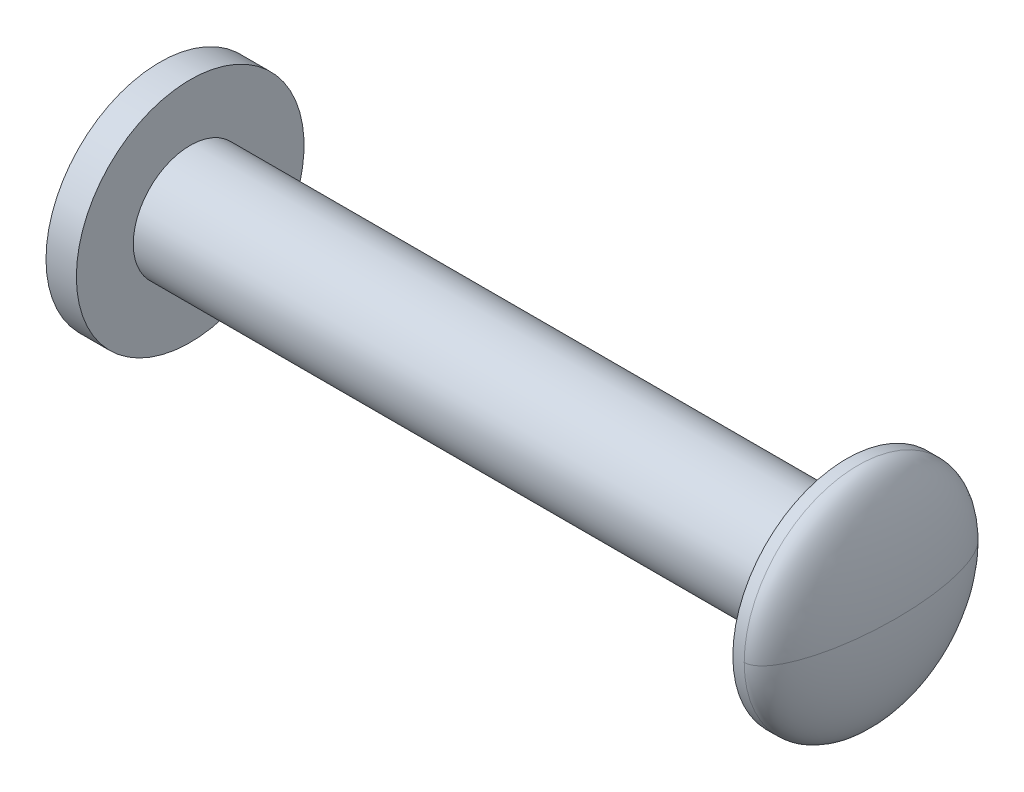
ISO-10303-21;
HEADER;
FILE_DESCRIPTION(('STEP AP214'),'2;1');
FILE_NAME('part.step','',(''),(''),'','','');
FILE_SCHEMA(('AUTOMOTIVE_DESIGN { 1 0 10303 214 1 1 1 1 }'));
ENDSEC;
DATA;
#1=APPLICATION_CONTEXT('core data for automotive mechanical design processes');
#2=APPLICATION_PROTOCOL_DEFINITION('international standard','automotive_design',2000,#1);
#3=PRODUCT_CONTEXT('',#1,'mechanical');
#4=PRODUCT('Part','Part','',(#3));
#5=PRODUCT_RELATED_PRODUCT_CATEGORY('part','',(#4));
#6=PRODUCT_DEFINITION_FORMATION('','',#4);
#7=PRODUCT_DEFINITION_CONTEXT('part definition',#1,'design');
#8=PRODUCT_DEFINITION('design','',#6,#7);
#9=PRODUCT_DEFINITION_SHAPE('','',#8);
#10=(LENGTH_UNIT() NAMED_UNIT(*) SI_UNIT(.MILLI.,.METRE.));
#11=(NAMED_UNIT(*) PLANE_ANGLE_UNIT() SI_UNIT($,.RADIAN.));
#12=(NAMED_UNIT(*) SI_UNIT($,.STERADIAN.) SOLID_ANGLE_UNIT());
#13=UNCERTAINTY_MEASURE_WITH_UNIT(LENGTH_MEASURE(1.E-05),#10,'distance_accuracy_value','');
#14=(GEOMETRIC_REPRESENTATION_CONTEXT(3) GLOBAL_UNCERTAINTY_ASSIGNED_CONTEXT((#13)) GLOBAL_UNIT_ASSIGNED_CONTEXT((#10,
#11,#12)) REPRESENTATION_CONTEXT('',''));
#15=CARTESIAN_POINT('',(0.,0.,0.));
#16=DIRECTION('',(0.,0.,1.));
#17=DIRECTION('',(1.,0.,0.));
#18=AXIS2_PLACEMENT_3D('',#15,#16,#17);
#19=CARTESIAN_POINT('',(19.4,0.,0.));
#20=CARTESIAN_POINT('',(19.4,0.,0.));
#21=CARTESIAN_POINT('',(19.4,0.,0.));
#22=CARTESIAN_POINT('',(19.4,0.,0.));
#23=CARTESIAN_POINT('',(19.4,0.,-1.75735931288071));
#24=CARTESIAN_POINT('',(19.4,3.51471862576143,-1.75735931288071));
#25=CARTESIAN_POINT('',(19.4,3.51471862576143,1.75735931288071));
#26=CARTESIAN_POINT('',(19.4,0.,1.75735931288071));
#27=CARTESIAN_POINT('',(18.9857864376269,0.,-3.));
#28=CARTESIAN_POINT('',(18.9857864376269,6.,-3.));
#29=CARTESIAN_POINT('',(18.9857864376269,6.,3.));
#30=CARTESIAN_POINT('',(18.9857864376269,0.,3.));
#31=CARTESIAN_POINT('',(18.4,0.,-3.));
#32=CARTESIAN_POINT('',(18.4,6.,-3.));
#33=CARTESIAN_POINT('',(18.4,6.,3.));
#34=CARTESIAN_POINT('',(18.4,0.,3.));
#35=(BOUNDED_SURFACE() B_SPLINE_SURFACE(3,3,((#19,#20,#21,#22),(#23,#24,#25,#26),(#27,#28,#29,
#30),(#31,#32,#33,#34)),.UNSPECIFIED.,.F.,.F.,.F.) B_SPLINE_SURFACE_WITH_KNOTS((4,4),(4,4),(0.,
1.),(0.,1.),.UNSPECIFIED.) GEOMETRIC_REPRESENTATION_ITEM() RATIONAL_B_SPLINE_SURFACE(((1.,
0.333333333333333,0.333333333333333,1.),(0.804737854124365,0.268245951374788,0.268245951374788,
0.804737854124365),(0.804737854124365,0.268245951374788,0.268245951374788,0.804737854124365),
(1.,0.333333333333333,0.333333333333333,1.))) REPRESENTATION_ITEM('') SURFACE());
#36=CARTESIAN_POINT('',(19.4,0.,0.));
#37=CARTESIAN_POINT('',(19.4,0.,-1.75735931288071));
#38=CARTESIAN_POINT('',(18.9857864376269,0.,-3.));
#39=CARTESIAN_POINT('',(18.4,0.,-3.));
#40=(BOUNDED_CURVE() B_SPLINE_CURVE(3,(#36,#37,#38,#39),.UNSPECIFIED.,.F.,
.F.) B_SPLINE_CURVE_WITH_KNOTS((4,4),(0.,1.),
.UNSPECIFIED.) CURVE() GEOMETRIC_REPRESENTATION_ITEM() RATIONAL_B_SPLINE_CURVE((1.,
0.804737854124365,0.804737854124365,1.)) REPRESENTATION_ITEM(''));
#41=CARTESIAN_POINT('',(18.4,0.,-3.));
#42=VERTEX_POINT('',#41);
#43=CARTESIAN_POINT('',(19.4,0.,0.));
#44=VERTEX_POINT('',#43);
#45=EDGE_CURVE('E40',#42,#44,#40,.F.);
#46=CARTESIAN_POINT('',(18.4,0.,0.));
#47=DIRECTION('',(-1.,0.,0.));
#48=DIRECTION('',(0.,0.,1.));
#49=AXIS2_PLACEMENT_3D('',#46,#47,#48);
#50=CIRCLE('',#49,3.);
#51=CARTESIAN_POINT('',(18.4,0.,3.));
#52=VERTEX_POINT('',#51);
#53=EDGE_CURVE('E35',#52,#42,#50,.T.);
#54=CARTESIAN_POINT('',(19.4,0.,0.));
#55=CARTESIAN_POINT('',(19.4,0.,1.75735931288071));
#56=CARTESIAN_POINT('',(18.9857864376269,0.,3.));
#57=CARTESIAN_POINT('',(18.4,0.,3.));
#58=(BOUNDED_CURVE() B_SPLINE_CURVE(3,(#54,#55,#56,#57),.UNSPECIFIED.,.F.,
.F.) B_SPLINE_CURVE_WITH_KNOTS((4,4),(0.,1.),
.UNSPECIFIED.) CURVE() GEOMETRIC_REPRESENTATION_ITEM() RATIONAL_B_SPLINE_CURVE((1.,
0.804737854124365,0.804737854124365,1.)) REPRESENTATION_ITEM(''));
#59=EDGE_CURVE('E38',#44,#52,#58,.T.);
#60=ORIENTED_EDGE('',*,*,#45,.F.);
#61=ORIENTED_EDGE('',*,*,#53,.F.);
#62=ORIENTED_EDGE('',*,*,#59,.F.);
#63=EDGE_LOOP('',(#60,#61,#62));
#64=FACE_BOUND('',#63,.T.);
#65=ADVANCED_FACE('F15',(#64),#35,.T.);
#66=CARTESIAN_POINT('',(19.4,0.,0.));
#67=CARTESIAN_POINT('',(19.4,0.,0.));
#68=CARTESIAN_POINT('',(19.4,0.,0.));
#69=CARTESIAN_POINT('',(19.4,0.,0.));
#70=CARTESIAN_POINT('',(19.4,0.,1.75735931288071));
#71=CARTESIAN_POINT('',(19.4,-3.51471862576143,1.75735931288072));
#72=CARTESIAN_POINT('',(19.4,-3.51471862576143,-1.75735931288071));
#73=CARTESIAN_POINT('',(19.4,0.,-1.75735931288071));
#74=CARTESIAN_POINT('',(18.9857864376269,0.,3.));
#75=CARTESIAN_POINT('',(18.9857864376269,-6.,3.));
#76=CARTESIAN_POINT('',(18.9857864376269,-6.,-3.));
#77=CARTESIAN_POINT('',(18.9857864376269,0.,-3.));
#78=CARTESIAN_POINT('',(18.4,0.,3.));
#79=CARTESIAN_POINT('',(18.4,-6.,3.));
#80=CARTESIAN_POINT('',(18.4,-6.,-3.));
#81=CARTESIAN_POINT('',(18.4,0.,-3.));
#82=(BOUNDED_SURFACE() B_SPLINE_SURFACE(3,3,((#66,#67,#68,#69),(#70,#71,#72,#73),(#74,#75,#76,
#77),(#78,#79,#80,#81)),.UNSPECIFIED.,.F.,.F.,.F.) B_SPLINE_SURFACE_WITH_KNOTS((4,4),(4,4),(0.,
1.),(0.,1.),.UNSPECIFIED.) GEOMETRIC_REPRESENTATION_ITEM() RATIONAL_B_SPLINE_SURFACE(((1.,
0.333333333333333,0.333333333333333,1.),(0.804737854124365,0.268245951374788,0.268245951374788,
0.804737854124365),(0.804737854124365,0.268245951374788,0.268245951374788,0.804737854124365),
(1.,0.333333333333333,0.333333333333333,1.))) REPRESENTATION_ITEM('') SURFACE());
#83=CARTESIAN_POINT('',(18.4,0.,0.));
#84=DIRECTION('',(-1.,0.,0.));
#85=DIRECTION('',(0.,0.,1.));
#86=AXIS2_PLACEMENT_3D('',#83,#84,#85);
#87=CIRCLE('',#86,3.);
#88=EDGE_CURVE('E47',#42,#52,#87,.T.);
#89=ORIENTED_EDGE('',*,*,#59,.T.);
#90=ORIENTED_EDGE('',*,*,#88,.F.);
#91=ORIENTED_EDGE('',*,*,#45,.T.);
#92=EDGE_LOOP('',(#89,#90,#91));
#93=FACE_BOUND('',#92,.T.);
#94=ADVANCED_FACE('F46',(#93),#82,.T.);
#95=CARTESIAN_POINT('',(0.,0.,0.));
#96=DIRECTION('',(1.,0.,0.));
#97=DIRECTION('',(0.,0.,-1.));
#98=AXIS2_PLACEMENT_3D('',#95,#96,#97);
#99=PLANE('',#98);
#100=CARTESIAN_POINT('',(0.,0.,0.));
#101=DIRECTION('',(-1.,0.,0.));
#102=DIRECTION('',(0.,0.,1.));
#103=AXIS2_PLACEMENT_3D('',#100,#101,#102);
#104=CIRCLE('',#103,3.);
#105=CARTESIAN_POINT('',(0.,0.,3.));
#106=VERTEX_POINT('',#105);
#107=EDGE_CURVE('E20',#106,#106,#104,.F.);
#108=ORIENTED_EDGE('',*,*,#107,.F.);
#109=EDGE_LOOP('',(#108));
#110=FACE_BOUND('',#109,.T.);
#111=ADVANCED_FACE('F90',(#110),#99,.F.);
#112=CARTESIAN_POINT('',(18.4,0.,0.));
#113=DIRECTION('',(-1.,0.,0.));
#114=DIRECTION('',(0.,0.,1.));
#115=AXIS2_PLACEMENT_3D('',#112,#113,#114);
#116=CYLINDRICAL_SURFACE('',#115,3.);
#117=ORIENTED_EDGE('',*,*,#53,.T.);
#118=ORIENTED_EDGE('',*,*,#88,.T.);
#119=EDGE_LOOP('',(#117,#118));
#120=FACE_BOUND('',#119,.T.);
#121=CARTESIAN_POINT('',(18.1,0.,0.));
#122=DIRECTION('',(-1.,0.,0.));
#123=DIRECTION('',(0.,0.,1.));
#124=AXIS2_PLACEMENT_3D('',#121,#122,#123);
#125=CIRCLE('',#124,3.);
#126=CARTESIAN_POINT('',(18.1,0.,3.));
#127=VERTEX_POINT('',#126);
#128=EDGE_CURVE('E69',#127,#127,#125,.F.);
#129=ORIENTED_EDGE('',*,*,#128,.T.);
#130=EDGE_LOOP('',(#129));
#131=FACE_BOUND('',#130,.T.);
#132=ADVANCED_FACE('F87',(#120,#131),#116,.T.);
#133=CARTESIAN_POINT('',(0.8,0.,0.));
#134=DIRECTION('',(-1.,0.,0.));
#135=DIRECTION('',(0.,0.,1.));
#136=AXIS2_PLACEMENT_3D('',#133,#134,#135);
#137=CYLINDRICAL_SURFACE('',#136,3.);
#138=ORIENTED_EDGE('',*,*,#107,.T.);
#139=EDGE_LOOP('',(#138));
#140=FACE_BOUND('',#139,.T.);
#141=CARTESIAN_POINT('',(0.8,0.,0.));
#142=DIRECTION('',(-1.,0.,0.));
#143=DIRECTION('',(0.,0.,1.));
#144=AXIS2_PLACEMENT_3D('',#141,#142,#143);
#145=CIRCLE('',#144,3.);
#146=CARTESIAN_POINT('',(0.8,0.,3.));
#147=VERTEX_POINT('',#146);
#148=EDGE_CURVE('E66',#147,#147,#145,.F.);
#149=ORIENTED_EDGE('',*,*,#148,.F.);
#150=EDGE_LOOP('',(#149));
#151=FACE_BOUND('',#150,.T.);
#152=ADVANCED_FACE('F89',(#140,#151),#137,.T.);
#153=CARTESIAN_POINT('',(18.1,0.,0.));
#154=DIRECTION('',(1.,0.,0.));
#155=DIRECTION('',(0.,0.,-1.));
#156=AXIS2_PLACEMENT_3D('',#153,#154,#155);
#157=PLANE('',#156);
#158=ORIENTED_EDGE('',*,*,#128,.F.);
#159=EDGE_LOOP('',(#158));
#160=FACE_BOUND('',#159,.T.);
#161=CARTESIAN_POINT('',(18.1,0.,0.));
#162=DIRECTION('',(-1.,0.,0.));
#163=DIRECTION('',(0.,0.,1.));
#164=AXIS2_PLACEMENT_3D('',#161,#162,#163);
#165=CIRCLE('',#164,1.5);
#166=CARTESIAN_POINT('',(18.1,0.,1.5));
#167=VERTEX_POINT('',#166);
#168=EDGE_CURVE('E27',#167,#167,#165,.T.);
#169=ORIENTED_EDGE('',*,*,#168,.F.);
#170=EDGE_LOOP('',(#169));
#171=FACE_BOUND('',#170,.T.);
#172=ADVANCED_FACE('F97',(#160,#171),#157,.F.);
#173=CARTESIAN_POINT('',(0.8,0.,0.));
#174=DIRECTION('',(1.,0.,0.));
#175=DIRECTION('',(0.,0.,-1.));
#176=AXIS2_PLACEMENT_3D('',#173,#174,#175);
#177=PLANE('',#176);
#178=ORIENTED_EDGE('',*,*,#148,.T.);
#179=EDGE_LOOP('',(#178));
#180=FACE_BOUND('',#179,.T.);
#181=CARTESIAN_POINT('',(0.799999999999999,0.,0.));
#182=DIRECTION('',(-1.,0.,0.));
#183=DIRECTION('',(0.,0.,1.));
#184=AXIS2_PLACEMENT_3D('',#181,#182,#183);
#185=CIRCLE('',#184,1.5);
#186=CARTESIAN_POINT('',(0.799999999999999,0.,1.5));
#187=VERTEX_POINT('',#186);
#188=EDGE_CURVE('E9',#187,#187,#185,.F.);
#189=ORIENTED_EDGE('',*,*,#188,.F.);
#190=EDGE_LOOP('',(#189));
#191=FACE_BOUND('',#190,.T.);
#192=ADVANCED_FACE('F103',(#180,#191),#177,.T.);
#193=CARTESIAN_POINT('',(18.1,0.,0.));
#194=DIRECTION('',(-1.,0.,0.));
#195=DIRECTION('',(0.,0.,1.));
#196=AXIS2_PLACEMENT_3D('',#193,#194,#195);
#197=CYLINDRICAL_SURFACE('',#196,1.5);
#198=ORIENTED_EDGE('',*,*,#188,.T.);
#199=EDGE_LOOP('',(#198));
#200=FACE_BOUND('',#199,.T.);
#201=ORIENTED_EDGE('',*,*,#168,.T.);
#202=EDGE_LOOP('',(#201));
#203=FACE_BOUND('',#202,.T.);
#204=ADVANCED_FACE('F101',(#200,#203),#197,.T.);
#205=CLOSED_SHELL('',(#65,#94,#111,#132,#152,#172,#192,#204));
#206=MANIFOLD_SOLID_BREP('B1',#205);
#207=ADVANCED_BREP_SHAPE_REPRESENTATION('',(#18,#206),#14);
#208=SHAPE_DEFINITION_REPRESENTATION(#9,#207);
ENDSEC;
END-ISO-10303-21;
